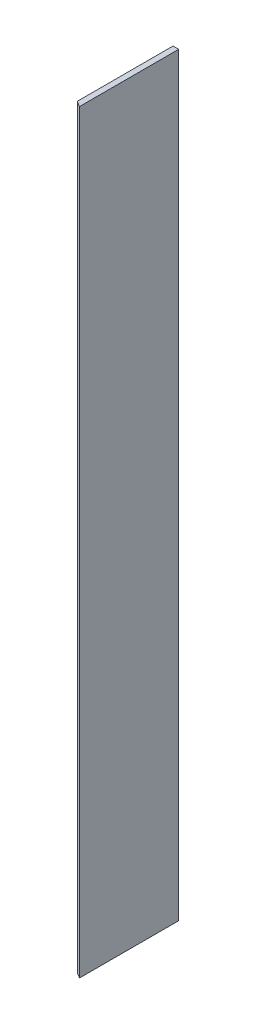
ISO-10303-21;
HEADER;
FILE_DESCRIPTION(('STEP AP214'),'2;1');
FILE_NAME('part.step','',(''),(''),'','','');
FILE_SCHEMA(('AUTOMOTIVE_DESIGN { 1 0 10303 214 1 1 1 1 }'));
ENDSEC;
DATA;
#1=APPLICATION_CONTEXT('core data for automotive mechanical design processes');
#2=APPLICATION_PROTOCOL_DEFINITION('international standard','automotive_design',2000,#1);
#3=PRODUCT_CONTEXT('',#1,'mechanical');
#4=PRODUCT('Part','Part','',(#3));
#5=PRODUCT_RELATED_PRODUCT_CATEGORY('part','',(#4));
#6=PRODUCT_DEFINITION_FORMATION('','',#4);
#7=PRODUCT_DEFINITION_CONTEXT('part definition',#1,'design');
#8=PRODUCT_DEFINITION('design','',#6,#7);
#9=PRODUCT_DEFINITION_SHAPE('','',#8);
#10=(LENGTH_UNIT() NAMED_UNIT(*) SI_UNIT(.MILLI.,.METRE.));
#11=(NAMED_UNIT(*) PLANE_ANGLE_UNIT() SI_UNIT($,.RADIAN.));
#12=(NAMED_UNIT(*) SI_UNIT($,.STERADIAN.) SOLID_ANGLE_UNIT());
#13=UNCERTAINTY_MEASURE_WITH_UNIT(LENGTH_MEASURE(1.E-05),#10,'distance_accuracy_value','');
#14=(GEOMETRIC_REPRESENTATION_CONTEXT(3) GLOBAL_UNCERTAINTY_ASSIGNED_CONTEXT((#13)) GLOBAL_UNIT_ASSIGNED_CONTEXT((#10,
#11,#12)) REPRESENTATION_CONTEXT('',''));
#15=CARTESIAN_POINT('',(0.,0.,0.));
#16=DIRECTION('',(0.,0.,1.));
#17=DIRECTION('',(1.,0.,0.));
#18=AXIS2_PLACEMENT_3D('',#15,#16,#17);
#19=CARTESIAN_POINT('',(0.999999999999996,533.,0.));
#20=DIRECTION('',(1.,0.,0.));
#21=DIRECTION('',(0.,0.,-1.));
#22=AXIS2_PLACEMENT_3D('',#19,#20,#21);
#23=PLANE('',#22);
#24=DIRECTION('',(0.,0.,1.));
#25=VECTOR('',#24,1.);
#26=CARTESIAN_POINT('',(0.999999999999996,0.,0.));
#27=LINE('',#26,#25);
#28=CARTESIAN_POINT('',(0.999999999999996,0.,0.));
#29=VERTEX_POINT('',#28);
#30=CARTESIAN_POINT('',(0.999999999999996,0.,67.6360015143482));
#31=VERTEX_POINT('',#30);
#32=EDGE_CURVE('E96',#29,#31,#27,.T.);
#33=ORIENTED_EDGE('',*,*,#32,.T.);
#34=DIRECTION('',(0.,-1.,0.));
#35=VECTOR('',#34,1.);
#36=CARTESIAN_POINT('',(0.999999999999996,533.,67.6360015143482));
#37=LINE('',#36,#35);
#38=CARTESIAN_POINT('',(0.999999999999996,533.,67.6360015143482));
#39=VERTEX_POINT('',#38);
#40=EDGE_CURVE('E11',#39,#31,#37,.T.);
#41=ORIENTED_EDGE('',*,*,#40,.F.);
#42=DIRECTION('',(0.,0.,1.));
#43=VECTOR('',#42,1.);
#44=CARTESIAN_POINT('',(0.999999999999996,533.,0.));
#45=LINE('',#44,#43);
#46=CARTESIAN_POINT('',(0.999999999999996,533.,0.));
#47=VERTEX_POINT('',#46);
#48=EDGE_CURVE('E84',#47,#39,#45,.T.);
#49=ORIENTED_EDGE('',*,*,#48,.F.);
#50=DIRECTION('',(0.,-1.,0.));
#51=VECTOR('',#50,1.);
#52=CARTESIAN_POINT('',(0.999999999999996,533.,0.));
#53=LINE('',#52,#51);
#54=EDGE_CURVE('E92',#47,#29,#53,.T.);
#55=ORIENTED_EDGE('',*,*,#54,.T.);
#56=EDGE_LOOP('',(#33,#41,#49,#55));
#57=FACE_BOUND('',#56,.T.);
#58=ADVANCED_FACE('F33',(#57),#23,.F.);
#59=CARTESIAN_POINT('',(0.999999999999996,533.,67.6360015143482));
#60=DIRECTION('',(0.519639012363709,0.,-0.854385917972475));
#61=DIRECTION('',(-0.854385917972475,0.,-0.519639012363709));
#62=AXIS2_PLACEMENT_3D('',#59,#60,#61);
#63=PLANE('',#62);
#64=DIRECTION('',(0.854385917972475,0.,0.519639012363709));
#65=VECTOR('',#64,1.);
#66=CARTESIAN_POINT('',(0.999999999999996,0.,67.6360015143482));
#67=LINE('',#66,#65);
#68=CARTESIAN_POINT('',(5.,0.,70.0688085231381));
#69=VERTEX_POINT('',#68);
#70=EDGE_CURVE('E88',#31,#69,#67,.T.);
#71=ORIENTED_EDGE('',*,*,#70,.T.);
#72=DIRECTION('',(0.,-1.,0.));
#73=VECTOR('',#72,1.);
#74=CARTESIAN_POINT('',(5.,533.,70.0688085231381));
#75=LINE('',#74,#73);
#76=CARTESIAN_POINT('',(5.,533.,70.0688085231381));
#77=VERTEX_POINT('',#76);
#78=EDGE_CURVE('E41',#77,#69,#75,.T.);
#79=ORIENTED_EDGE('',*,*,#78,.F.);
#80=DIRECTION('',(0.854385917972475,0.,0.519639012363709));
#81=VECTOR('',#80,1.);
#82=CARTESIAN_POINT('',(0.999999999999996,533.,67.6360015143482));
#83=LINE('',#82,#81);
#84=EDGE_CURVE('E79',#39,#77,#83,.T.);
#85=ORIENTED_EDGE('',*,*,#84,.F.);
#86=ORIENTED_EDGE('',*,*,#40,.T.);
#87=EDGE_LOOP('',(#71,#79,#85,#86));
#88=FACE_BOUND('',#87,.T.);
#89=ADVANCED_FACE('F87',(#88),#63,.F.);
#90=CARTESIAN_POINT('',(5.,533.,0.));
#91=DIRECTION('',(-1.,0.,0.));
#92=DIRECTION('',(0.,0.,1.));
#93=AXIS2_PLACEMENT_3D('',#90,#91,#92);
#94=PLANE('',#93);
#95=DIRECTION('',(0.,0.,-1.));
#96=VECTOR('',#95,1.);
#97=CARTESIAN_POINT('',(5.,0.,0.));
#98=LINE('',#97,#96);
#99=CARTESIAN_POINT('',(5.,0.,0.));
#100=VERTEX_POINT('',#99);
#101=EDGE_CURVE('E66',#69,#100,#98,.T.);
#102=ORIENTED_EDGE('',*,*,#101,.T.);
#103=DIRECTION('',(0.,-1.,0.));
#104=VECTOR('',#103,1.);
#105=CARTESIAN_POINT('',(5.,533.,0.));
#106=LINE('',#105,#104);
#107=CARTESIAN_POINT('',(5.,533.,0.));
#108=VERTEX_POINT('',#107);
#109=EDGE_CURVE('E89',#108,#100,#106,.T.);
#110=ORIENTED_EDGE('',*,*,#109,.F.);
#111=DIRECTION('',(0.,0.,-1.));
#112=VECTOR('',#111,1.);
#113=CARTESIAN_POINT('',(5.,533.,0.));
#114=LINE('',#113,#112);
#115=EDGE_CURVE('E82',#77,#108,#114,.T.);
#116=ORIENTED_EDGE('',*,*,#115,.F.);
#117=ORIENTED_EDGE('',*,*,#78,.T.);
#118=EDGE_LOOP('',(#102,#110,#116,#117));
#119=FACE_BOUND('',#118,.T.);
#120=ADVANCED_FACE('F90',(#119),#94,.F.);
#121=CARTESIAN_POINT('',(0.999999999999996,533.,0.));
#122=DIRECTION('',(0.,0.,1.));
#123=DIRECTION('',(1.,0.,0.));
#124=AXIS2_PLACEMENT_3D('',#121,#122,#123);
#125=PLANE('',#124);
#126=DIRECTION('',(-1.,0.,0.));
#127=VECTOR('',#126,1.);
#128=CARTESIAN_POINT('',(0.999999999999996,0.,0.));
#129=LINE('',#128,#127);
#130=EDGE_CURVE('E72',#100,#29,#129,.T.);
#131=ORIENTED_EDGE('',*,*,#130,.T.);
#132=ORIENTED_EDGE('',*,*,#54,.F.);
#133=DIRECTION('',(-1.,0.,0.));
#134=VECTOR('',#133,1.);
#135=CARTESIAN_POINT('',(0.999999999999996,533.,0.));
#136=LINE('',#135,#134);
#137=EDGE_CURVE('E49',#108,#47,#136,.T.);
#138=ORIENTED_EDGE('',*,*,#137,.F.);
#139=ORIENTED_EDGE('',*,*,#109,.T.);
#140=EDGE_LOOP('',(#131,#132,#138,#139));
#141=FACE_BOUND('',#140,.T.);
#142=ADVANCED_FACE('F103',(#141),#125,.F.);
#143=CARTESIAN_POINT('',(0.999999999999996,533.,0.));
#144=DIRECTION('',(0.,1.,0.));
#145=DIRECTION('',(0.,0.,1.));
#146=AXIS2_PLACEMENT_3D('',#143,#144,#145);
#147=PLANE('',#146);
#148=ORIENTED_EDGE('',*,*,#48,.T.);
#149=ORIENTED_EDGE('',*,*,#84,.T.);
#150=ORIENTED_EDGE('',*,*,#115,.T.);
#151=ORIENTED_EDGE('',*,*,#137,.T.);
#152=EDGE_LOOP('',(#148,#149,#150,#151));
#153=FACE_BOUND('',#152,.T.);
#154=ADVANCED_FACE('F80',(#153),#147,.T.);
#155=CARTESIAN_POINT('',(0.999999999999996,0.,0.));
#156=DIRECTION('',(0.,1.,0.));
#157=DIRECTION('',(0.,0.,1.));
#158=AXIS2_PLACEMENT_3D('',#155,#156,#157);
#159=PLANE('',#158);
#160=ORIENTED_EDGE('',*,*,#32,.F.);
#161=ORIENTED_EDGE('',*,*,#130,.F.);
#162=ORIENTED_EDGE('',*,*,#101,.F.);
#163=ORIENTED_EDGE('',*,*,#70,.F.);
#164=EDGE_LOOP('',(#160,#161,#162,#163));
#165=FACE_BOUND('',#164,.T.);
#166=ADVANCED_FACE('F106',(#165),#159,.F.);
#167=CLOSED_SHELL('',(#58,#89,#120,#142,#154,#166));
#168=MANIFOLD_SOLID_BREP('B2',#167);
#169=ADVANCED_BREP_SHAPE_REPRESENTATION('',(#18,#168),#14);
#170=SHAPE_DEFINITION_REPRESENTATION(#9,#169);
ENDSEC;
END-ISO-10303-21;
